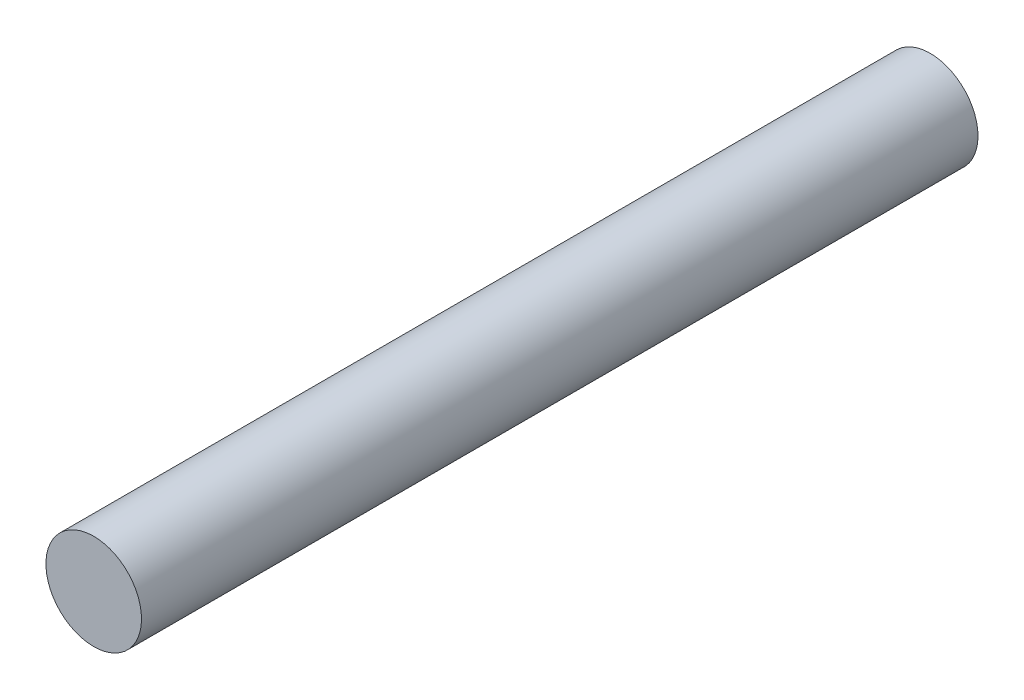
ISO-10303-21;
HEADER;
FILE_DESCRIPTION(('STEP AP214'),'2;1');
FILE_NAME('part.step','',(''),(''),'','','');
FILE_SCHEMA(('AUTOMOTIVE_DESIGN { 1 0 10303 214 1 1 1 1 }'));
ENDSEC;
DATA;
#1=APPLICATION_CONTEXT('core data for automotive mechanical design processes');
#2=APPLICATION_PROTOCOL_DEFINITION('international standard','automotive_design',2000,#1);
#3=PRODUCT_CONTEXT('',#1,'mechanical');
#4=PRODUCT('Part','Part','',(#3));
#5=PRODUCT_RELATED_PRODUCT_CATEGORY('part','',(#4));
#6=PRODUCT_DEFINITION_FORMATION('','',#4);
#7=PRODUCT_DEFINITION_CONTEXT('part definition',#1,'design');
#8=PRODUCT_DEFINITION('design','',#6,#7);
#9=PRODUCT_DEFINITION_SHAPE('','',#8);
#10=(LENGTH_UNIT() NAMED_UNIT(*) SI_UNIT(.MILLI.,.METRE.));
#11=(NAMED_UNIT(*) PLANE_ANGLE_UNIT() SI_UNIT($,.RADIAN.));
#12=(NAMED_UNIT(*) SI_UNIT($,.STERADIAN.) SOLID_ANGLE_UNIT());
#13=UNCERTAINTY_MEASURE_WITH_UNIT(LENGTH_MEASURE(1.E-05),#10,'distance_accuracy_value','');
#14=(GEOMETRIC_REPRESENTATION_CONTEXT(3) GLOBAL_UNCERTAINTY_ASSIGNED_CONTEXT((#13)) GLOBAL_UNIT_ASSIGNED_CONTEXT((#10,
#11,#12)) REPRESENTATION_CONTEXT('',''));
#15=CARTESIAN_POINT('',(0.,0.,0.));
#16=DIRECTION('',(0.,0.,1.));
#17=DIRECTION('',(1.,0.,0.));
#18=AXIS2_PLACEMENT_3D('',#15,#16,#17);
#19=CARTESIAN_POINT('',(0.,0.,17.5));
#20=DIRECTION('',(0.,0.,-1.));
#21=DIRECTION('',(-1.,0.,0.));
#22=AXIS2_PLACEMENT_3D('',#19,#20,#21);
#23=CYLINDRICAL_SURFACE('',#22,1.);
#24=CARTESIAN_POINT('',(0.,0.,17.5));
#25=DIRECTION('',(0.,0.,1.));
#26=DIRECTION('',(1.,0.,0.));
#27=AXIS2_PLACEMENT_3D('',#24,#25,#26);
#28=CIRCLE('',#27,1.);
#29=CARTESIAN_POINT('',(1.,0.,17.5));
#30=VERTEX_POINT('',#29);
#31=EDGE_CURVE('E10',#30,#30,#28,.T.);
#32=ORIENTED_EDGE('',*,*,#31,.F.);
#33=EDGE_LOOP('',(#32));
#34=FACE_BOUND('',#33,.T.);
#35=CARTESIAN_POINT('',(0.,0.,0.));
#36=DIRECTION('',(0.,0.,1.));
#37=DIRECTION('',(1.,0.,0.));
#38=AXIS2_PLACEMENT_3D('',#35,#36,#37);
#39=CIRCLE('',#38,1.);
#40=CARTESIAN_POINT('',(1.,0.,0.));
#41=VERTEX_POINT('',#40);
#42=EDGE_CURVE('E35',#41,#41,#39,.T.);
#43=ORIENTED_EDGE('',*,*,#42,.T.);
#44=EDGE_LOOP('',(#43));
#45=FACE_BOUND('',#44,.T.);
#46=ADVANCED_FACE('F32',(#34,#45),#23,.T.);
#47=CARTESIAN_POINT('',(0.,0.,17.5));
#48=DIRECTION('',(0.,0.,1.));
#49=DIRECTION('',(1.,0.,0.));
#50=AXIS2_PLACEMENT_3D('',#47,#48,#49);
#51=PLANE('',#50);
#52=ORIENTED_EDGE('',*,*,#31,.T.);
#53=EDGE_LOOP('',(#52));
#54=FACE_BOUND('',#53,.T.);
#55=ADVANCED_FACE('F47',(#54),#51,.T.);
#56=CARTESIAN_POINT('',(0.,0.,0.));
#57=DIRECTION('',(0.,0.,1.));
#58=DIRECTION('',(1.,0.,0.));
#59=AXIS2_PLACEMENT_3D('',#56,#57,#58);
#60=PLANE('',#59);
#61=ORIENTED_EDGE('',*,*,#42,.F.);
#62=EDGE_LOOP('',(#61));
#63=FACE_BOUND('',#62,.T.);
#64=ADVANCED_FACE('F45',(#63),#60,.F.);
#65=CLOSED_SHELL('',(#46,#55,#64));
#66=MANIFOLD_SOLID_BREP('B2',#65);
#67=ADVANCED_BREP_SHAPE_REPRESENTATION('',(#18,#66),#14);
#68=SHAPE_DEFINITION_REPRESENTATION(#9,#67);
ENDSEC;
END-ISO-10303-21;
